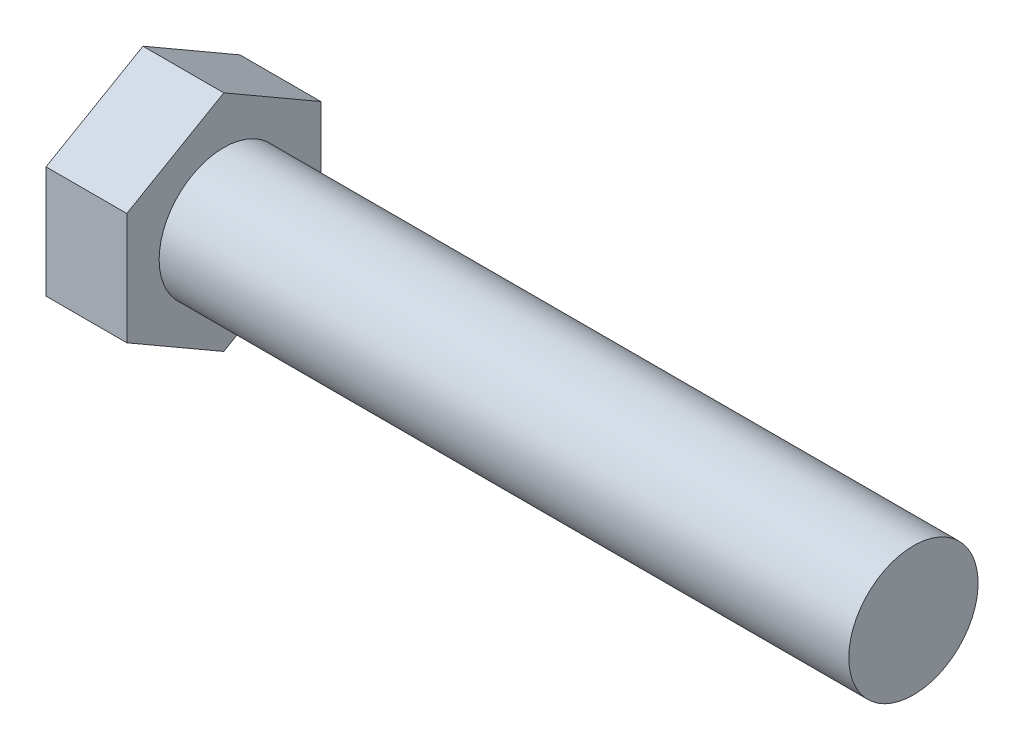
ISO-10303-21;
HEADER;
FILE_DESCRIPTION(('STEP AP214'),'2;1');
FILE_NAME('part.step','',(''),(''),'','','');
FILE_SCHEMA(('AUTOMOTIVE_DESIGN { 1 0 10303 214 1 1 1 1 }'));
ENDSEC;
DATA;
#1=APPLICATION_CONTEXT('core data for automotive mechanical design processes');
#2=APPLICATION_PROTOCOL_DEFINITION('international standard','automotive_design',2000,#1);
#3=PRODUCT_CONTEXT('',#1,'mechanical');
#4=PRODUCT('Part','Part','',(#3));
#5=PRODUCT_RELATED_PRODUCT_CATEGORY('part','',(#4));
#6=PRODUCT_DEFINITION_FORMATION('','',#4);
#7=PRODUCT_DEFINITION_CONTEXT('part definition',#1,'design');
#8=PRODUCT_DEFINITION('design','',#6,#7);
#9=PRODUCT_DEFINITION_SHAPE('','',#8);
#10=(LENGTH_UNIT() NAMED_UNIT(*) SI_UNIT(.MILLI.,.METRE.));
#11=(NAMED_UNIT(*) PLANE_ANGLE_UNIT() SI_UNIT($,.RADIAN.));
#12=(NAMED_UNIT(*) SI_UNIT($,.STERADIAN.) SOLID_ANGLE_UNIT());
#13=UNCERTAINTY_MEASURE_WITH_UNIT(LENGTH_MEASURE(1.E-05),#10,'distance_accuracy_value','');
#14=(GEOMETRIC_REPRESENTATION_CONTEXT(3) GLOBAL_UNCERTAINTY_ASSIGNED_CONTEXT((#13)) GLOBAL_UNIT_ASSIGNED_CONTEXT((#10,
#11,#12)) REPRESENTATION_CONTEXT('',''));
#15=CARTESIAN_POINT('',(0.,0.,0.));
#16=DIRECTION('',(0.,0.,1.));
#17=DIRECTION('',(1.,0.,0.));
#18=AXIS2_PLACEMENT_3D('',#15,#16,#17);
#19=CARTESIAN_POINT('',(-22.4234375,0.,0.));
#20=DIRECTION('',(1.,0.,0.));
#21=DIRECTION('',(0.,0.,1.));
#22=AXIS2_PLACEMENT_3D('',#19,#20,#21);
#23=CYLINDRICAL_SURFACE('',#22,4.7625);
#24=CARTESIAN_POINT('',(-22.4234375,0.,0.));
#25=DIRECTION('',(1.,0.,0.));
#26=DIRECTION('',(0.,0.,-1.));
#27=AXIS2_PLACEMENT_3D('',#24,#25,#26);
#28=CIRCLE('',#27,4.7625);
#29=CARTESIAN_POINT('',(-22.4234375,0.,-4.7625));
#30=VERTEX_POINT('',#29);
#31=EDGE_CURVE('E53',#30,#30,#28,.F.);
#32=ORIENTED_EDGE('',*,*,#31,.F.);
#33=EDGE_LOOP('',(#32));
#34=FACE_BOUND('',#33,.T.);
#35=CARTESIAN_POINT('',(28.3765625,0.,0.));
#36=DIRECTION('',(-1.,0.,0.));
#37=DIRECTION('',(0.,0.,1.));
#38=AXIS2_PLACEMENT_3D('',#35,#36,#37);
#39=CIRCLE('',#38,4.7625);
#40=CARTESIAN_POINT('',(28.3765625,0.,4.7625));
#41=VERTEX_POINT('',#40);
#42=EDGE_CURVE('E11',#41,#41,#39,.T.);
#43=ORIENTED_EDGE('',*,*,#42,.T.);
#44=EDGE_LOOP('',(#43));
#45=FACE_BOUND('',#44,.T.);
#46=ADVANCED_FACE('F45',(#34,#45),#23,.T.);
#47=CARTESIAN_POINT('',(28.3765625,0.,0.));
#48=DIRECTION('',(1.,0.,0.));
#49=DIRECTION('',(0.,0.,1.));
#50=AXIS2_PLACEMENT_3D('',#47,#48,#49);
#51=PLANE('',#50);
#52=ORIENTED_EDGE('',*,*,#42,.F.);
#53=EDGE_LOOP('',(#52));
#54=FACE_BOUND('',#53,.T.);
#55=ADVANCED_FACE('F156',(#54),#51,.T.);
#56=CARTESIAN_POINT('',(-28.3765625,-4.12444598552339,-7.14375));
#57=DIRECTION('',(0.,0.,1.));
#58=DIRECTION('',(0.,1.,0.));
#59=AXIS2_PLACEMENT_3D('',#56,#57,#58);
#60=PLANE('',#59);
#61=DIRECTION('',(0.,1.,0.));
#62=VECTOR('',#61,1.);
#63=CARTESIAN_POINT('',(-22.4234375,-4.12444598552339,-7.14375));
#64=LINE('',#63,#62);
#65=CARTESIAN_POINT('',(-22.4234375,-4.12444598552339,-7.14375));
#66=VERTEX_POINT('',#65);
#67=CARTESIAN_POINT('',(-22.4234375,4.12444598552339,-7.14375));
#68=VERTEX_POINT('',#67);
#69=EDGE_CURVE('E128',#66,#68,#64,.T.);
#70=ORIENTED_EDGE('',*,*,#69,.F.);
#71=DIRECTION('',(1.,0.,0.));
#72=VECTOR('',#71,1.);
#73=CARTESIAN_POINT('',(-28.3765625,-4.12444598552339,-7.14375));
#74=LINE('',#73,#72);
#75=CARTESIAN_POINT('',(-28.3765625,-4.12444598552339,-7.14375));
#76=VERTEX_POINT('',#75);
#77=EDGE_CURVE('E127',#76,#66,#74,.T.);
#78=ORIENTED_EDGE('',*,*,#77,.F.);
#79=DIRECTION('',(0.,1.,0.));
#80=VECTOR('',#79,1.);
#81=CARTESIAN_POINT('',(-28.3765625,-4.12444598552339,-7.14375));
#82=LINE('',#81,#80);
#83=CARTESIAN_POINT('',(-28.3765625,4.12444598552339,-7.14375));
#84=VERTEX_POINT('',#83);
#85=EDGE_CURVE('E140',#76,#84,#82,.T.);
#86=ORIENTED_EDGE('',*,*,#85,.T.);
#87=DIRECTION('',(1.,0.,0.));
#88=VECTOR('',#87,1.);
#89=CARTESIAN_POINT('',(-28.3765625,4.12444598552339,-7.14375));
#90=LINE('',#89,#88);
#91=EDGE_CURVE('E147',#84,#68,#90,.T.);
#92=ORIENTED_EDGE('',*,*,#91,.T.);
#93=EDGE_LOOP('',(#70,#78,#86,#92));
#94=FACE_BOUND('',#93,.T.);
#95=ADVANCED_FACE('F160',(#94),#60,.F.);
#96=CARTESIAN_POINT('',(-28.3765625,4.12444598552339,-7.14375));
#97=DIRECTION('',(0.,-0.866025403784439,0.5));
#98=DIRECTION('',(0.,0.5,0.866025403784439));
#99=AXIS2_PLACEMENT_3D('',#96,#97,#98);
#100=PLANE('',#99);
#101=DIRECTION('',(0.,0.5,0.866025403784439));
#102=VECTOR('',#101,1.);
#103=CARTESIAN_POINT('',(-22.4234375,4.12444598552339,-7.14375));
#104=LINE('',#103,#102);
#105=CARTESIAN_POINT('',(-22.4234375,8.24889197104678,0.));
#106=VERTEX_POINT('',#105);
#107=EDGE_CURVE('E130',#68,#106,#104,.T.);
#108=ORIENTED_EDGE('',*,*,#107,.F.);
#109=ORIENTED_EDGE('',*,*,#91,.F.);
#110=DIRECTION('',(0.,0.5,0.866025403784439));
#111=VECTOR('',#110,1.);
#112=CARTESIAN_POINT('',(-28.3765625,4.12444598552339,-7.14375));
#113=LINE('',#112,#111);
#114=CARTESIAN_POINT('',(-28.3765625,8.24889197104678,0.));
#115=VERTEX_POINT('',#114);
#116=EDGE_CURVE('E93',#84,#115,#113,.T.);
#117=ORIENTED_EDGE('',*,*,#116,.T.);
#118=DIRECTION('',(1.,0.,0.));
#119=VECTOR('',#118,1.);
#120=CARTESIAN_POINT('',(-28.3765625,8.24889197104678,0.));
#121=LINE('',#120,#119);
#122=EDGE_CURVE('E144',#115,#106,#121,.T.);
#123=ORIENTED_EDGE('',*,*,#122,.T.);
#124=EDGE_LOOP('',(#108,#109,#117,#123));
#125=FACE_BOUND('',#124,.T.);
#126=ADVANCED_FACE('F164',(#125),#100,.F.);
#127=CARTESIAN_POINT('',(-28.3765625,8.24889197104678,0.));
#128=DIRECTION('',(0.,-0.866025403784439,-0.5));
#129=DIRECTION('',(0.,-0.5,0.866025403784439));
#130=AXIS2_PLACEMENT_3D('',#127,#128,#129);
#131=PLANE('',#130);
#132=DIRECTION('',(0.,-0.5,0.866025403784439));
#133=VECTOR('',#132,1.);
#134=CARTESIAN_POINT('',(-22.4234375,8.24889197104678,0.));
#135=LINE('',#134,#133);
#136=CARTESIAN_POINT('',(-22.4234375,4.12444598552339,7.14375));
#137=VERTEX_POINT('',#136);
#138=EDGE_CURVE('E133',#106,#137,#135,.T.);
#139=ORIENTED_EDGE('',*,*,#138,.F.);
#140=ORIENTED_EDGE('',*,*,#122,.F.);
#141=DIRECTION('',(0.,-0.5,0.866025403784439));
#142=VECTOR('',#141,1.);
#143=CARTESIAN_POINT('',(-28.3765625,8.24889197104678,0.));
#144=LINE('',#143,#142);
#145=CARTESIAN_POINT('',(-28.3765625,4.12444598552339,7.14375));
#146=VERTEX_POINT('',#145);
#147=EDGE_CURVE('E121',#115,#146,#144,.T.);
#148=ORIENTED_EDGE('',*,*,#147,.T.);
#149=DIRECTION('',(1.,0.,0.));
#150=VECTOR('',#149,1.);
#151=CARTESIAN_POINT('',(-28.3765625,4.12444598552339,7.14375));
#152=LINE('',#151,#150);
#153=EDGE_CURVE('E115',#146,#137,#152,.T.);
#154=ORIENTED_EDGE('',*,*,#153,.T.);
#155=EDGE_LOOP('',(#139,#140,#148,#154));
#156=FACE_BOUND('',#155,.T.);
#157=ADVANCED_FACE('F170',(#156),#131,.F.);
#158=CARTESIAN_POINT('',(-28.3765625,4.12444598552339,7.14375));
#159=DIRECTION('',(0.,0.,-1.));
#160=DIRECTION('',(0.,-1.,0.));
#161=AXIS2_PLACEMENT_3D('',#158,#159,#160);
#162=PLANE('',#161);
#163=DIRECTION('',(0.,-1.,0.));
#164=VECTOR('',#163,1.);
#165=CARTESIAN_POINT('',(-22.4234375,4.12444598552339,7.14375));
#166=LINE('',#165,#164);
#167=CARTESIAN_POINT('',(-22.4234375,-4.12444598552339,7.14375));
#168=VERTEX_POINT('',#167);
#169=EDGE_CURVE('E136',#137,#168,#166,.T.);
#170=ORIENTED_EDGE('',*,*,#169,.F.);
#171=ORIENTED_EDGE('',*,*,#153,.F.);
#172=DIRECTION('',(0.,-1.,0.));
#173=VECTOR('',#172,1.);
#174=CARTESIAN_POINT('',(-28.3765625,4.12444598552339,7.14375));
#175=LINE('',#174,#173);
#176=CARTESIAN_POINT('',(-28.3765625,-4.12444598552339,7.14375));
#177=VERTEX_POINT('',#176);
#178=EDGE_CURVE('E105',#146,#177,#175,.T.);
#179=ORIENTED_EDGE('',*,*,#178,.T.);
#180=DIRECTION('',(1.,0.,0.));
#181=VECTOR('',#180,1.);
#182=CARTESIAN_POINT('',(-28.3765625,-4.12444598552339,7.14375));
#183=LINE('',#182,#181);
#184=EDGE_CURVE('E110',#177,#168,#183,.T.);
#185=ORIENTED_EDGE('',*,*,#184,.T.);
#186=EDGE_LOOP('',(#170,#171,#179,#185));
#187=FACE_BOUND('',#186,.T.);
#188=ADVANCED_FACE('F118',(#187),#162,.F.);
#189=CARTESIAN_POINT('',(-28.3765625,-4.12444598552339,7.14375));
#190=DIRECTION('',(0.,0.866025403784439,-0.5));
#191=DIRECTION('',(0.,-0.5,-0.866025403784439));
#192=AXIS2_PLACEMENT_3D('',#189,#190,#191);
#193=PLANE('',#192);
#194=DIRECTION('',(0.,-0.5,-0.866025403784439));
#195=VECTOR('',#194,1.);
#196=CARTESIAN_POINT('',(-22.4234375,-4.12444598552339,7.14375));
#197=LINE('',#196,#195);
#198=CARTESIAN_POINT('',(-22.4234375,-8.24889197104678,0.));
#199=VERTEX_POINT('',#198);
#200=EDGE_CURVE('E112',#168,#199,#197,.T.);
#201=ORIENTED_EDGE('',*,*,#200,.F.);
#202=ORIENTED_EDGE('',*,*,#184,.F.);
#203=DIRECTION('',(0.,-0.5,-0.866025403784439));
#204=VECTOR('',#203,1.);
#205=CARTESIAN_POINT('',(-28.3765625,-4.12444598552339,7.14375));
#206=LINE('',#205,#204);
#207=CARTESIAN_POINT('',(-28.3765625,-8.24889197104678,0.));
#208=VERTEX_POINT('',#207);
#209=EDGE_CURVE('E101',#177,#208,#206,.T.);
#210=ORIENTED_EDGE('',*,*,#209,.T.);
#211=DIRECTION('',(1.,0.,0.));
#212=VECTOR('',#211,1.);
#213=CARTESIAN_POINT('',(-28.3765625,-8.24889197104678,0.));
#214=LINE('',#213,#212);
#215=EDGE_CURVE('E116',#208,#199,#214,.T.);
#216=ORIENTED_EDGE('',*,*,#215,.T.);
#217=EDGE_LOOP('',(#201,#202,#210,#216));
#218=FACE_BOUND('',#217,.T.);
#219=ADVANCED_FACE('F111',(#218),#193,.F.);
#220=CARTESIAN_POINT('',(-28.3765625,-8.24889197104678,0.));
#221=DIRECTION('',(0.,0.866025403784439,0.5));
#222=DIRECTION('',(0.,0.5,-0.866025403784439));
#223=AXIS2_PLACEMENT_3D('',#220,#221,#222);
#224=PLANE('',#223);
#225=DIRECTION('',(0.,0.5,-0.866025403784439));
#226=VECTOR('',#225,1.);
#227=CARTESIAN_POINT('',(-22.4234375,-8.24889197104678,0.));
#228=LINE('',#227,#226);
#229=EDGE_CURVE('E81',#199,#66,#228,.T.);
#230=ORIENTED_EDGE('',*,*,#229,.F.);
#231=ORIENTED_EDGE('',*,*,#215,.F.);
#232=DIRECTION('',(0.,0.5,-0.866025403784439));
#233=VECTOR('',#232,1.);
#234=CARTESIAN_POINT('',(-28.3765625,-8.24889197104678,0.));
#235=LINE('',#234,#233);
#236=EDGE_CURVE('E61',#208,#76,#235,.T.);
#237=ORIENTED_EDGE('',*,*,#236,.T.);
#238=ORIENTED_EDGE('',*,*,#77,.T.);
#239=EDGE_LOOP('',(#230,#231,#237,#238));
#240=FACE_BOUND('',#239,.T.);
#241=ADVANCED_FACE('F179',(#240),#224,.F.);
#242=CARTESIAN_POINT('',(-28.3765625,4.12444598552339,-7.14375));
#243=DIRECTION('',(-1.,0.,0.));
#244=DIRECTION('',(0.,0.,-1.));
#245=AXIS2_PLACEMENT_3D('',#242,#243,#244);
#246=PLANE('',#245);
#247=ORIENTED_EDGE('',*,*,#85,.F.);
#248=ORIENTED_EDGE('',*,*,#236,.F.);
#249=ORIENTED_EDGE('',*,*,#209,.F.);
#250=ORIENTED_EDGE('',*,*,#178,.F.);
#251=ORIENTED_EDGE('',*,*,#147,.F.);
#252=ORIENTED_EDGE('',*,*,#116,.F.);
#253=EDGE_LOOP('',(#247,#248,#249,#250,#251,#252));
#254=FACE_BOUND('',#253,.T.);
#255=ADVANCED_FACE('F103',(#254),#246,.T.);
#256=CARTESIAN_POINT('',(-22.4234375,4.12444598552339,-7.14375));
#257=DIRECTION('',(-1.,0.,0.));
#258=DIRECTION('',(0.,0.,-1.));
#259=AXIS2_PLACEMENT_3D('',#256,#257,#258);
#260=PLANE('',#259);
#261=ORIENTED_EDGE('',*,*,#31,.T.);
#262=EDGE_LOOP('',(#261));
#263=FACE_BOUND('',#262,.T.);
#264=ORIENTED_EDGE('',*,*,#69,.T.);
#265=ORIENTED_EDGE('',*,*,#107,.T.);
#266=ORIENTED_EDGE('',*,*,#138,.T.);
#267=ORIENTED_EDGE('',*,*,#169,.T.);
#268=ORIENTED_EDGE('',*,*,#200,.T.);
#269=ORIENTED_EDGE('',*,*,#229,.T.);
#270=EDGE_LOOP('',(#264,#265,#266,#267,#268,#269));
#271=FACE_BOUND('',#270,.T.);
#272=ADVANCED_FACE('F152',(#263,#271),#260,.F.);
#273=CLOSED_SHELL('',(#46,#55,#95,#126,#157,#188,#219,#241,#255,#272));
#274=MANIFOLD_SOLID_BREP('B2',#273);
#275=ADVANCED_BREP_SHAPE_REPRESENTATION('',(#18,#274),#14);
#276=SHAPE_DEFINITION_REPRESENTATION(#9,#275);
ENDSEC;
END-ISO-10303-21;
